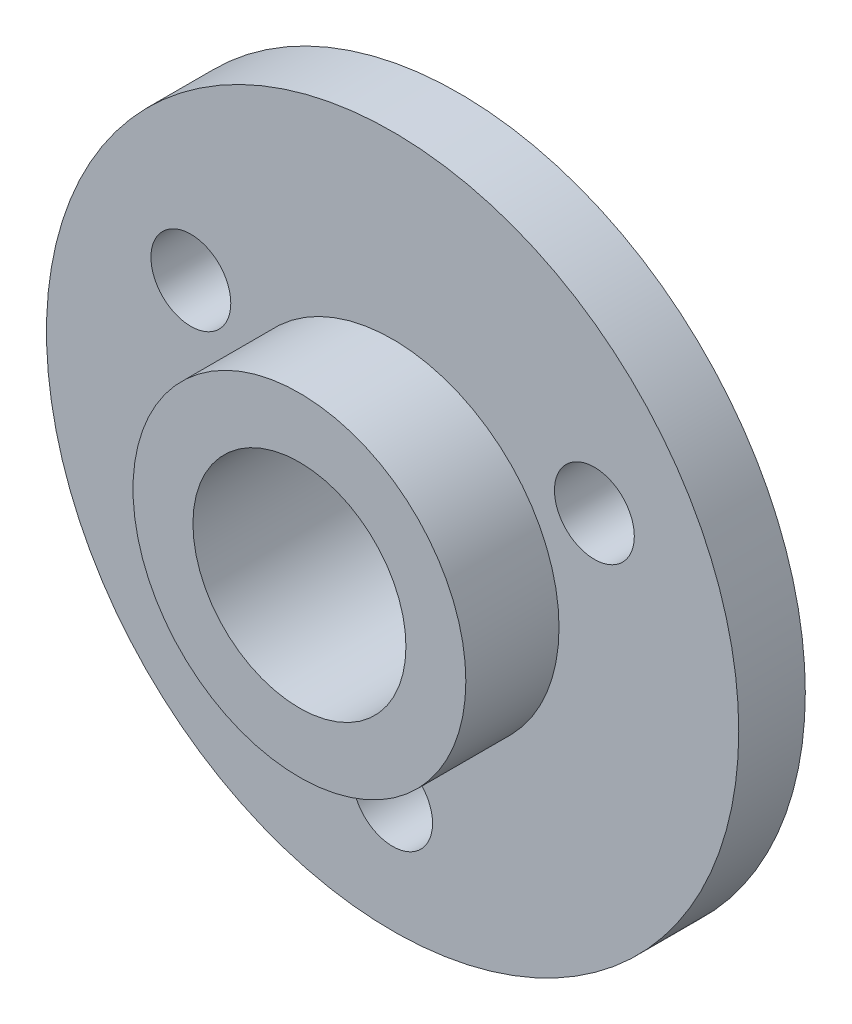
ISO-10303-21;
HEADER;
FILE_DESCRIPTION(('STEP AP214'),'2;1');
FILE_NAME('part.step','',(''),(''),'','','');
FILE_SCHEMA(('AUTOMOTIVE_DESIGN { 1 0 10303 214 1 1 1 1 }'));
ENDSEC;
DATA;
#1=APPLICATION_CONTEXT('core data for automotive mechanical design processes');
#2=APPLICATION_PROTOCOL_DEFINITION('international standard','automotive_design',2000,#1);
#3=PRODUCT_CONTEXT('',#1,'mechanical');
#4=PRODUCT('Part','Part','',(#3));
#5=PRODUCT_RELATED_PRODUCT_CATEGORY('part','',(#4));
#6=PRODUCT_DEFINITION_FORMATION('','',#4);
#7=PRODUCT_DEFINITION_CONTEXT('part definition',#1,'design');
#8=PRODUCT_DEFINITION('design','',#6,#7);
#9=PRODUCT_DEFINITION_SHAPE('','',#8);
#10=(LENGTH_UNIT() NAMED_UNIT(*) SI_UNIT(.MILLI.,.METRE.));
#11=(NAMED_UNIT(*) PLANE_ANGLE_UNIT() SI_UNIT($,.RADIAN.));
#12=(NAMED_UNIT(*) SI_UNIT($,.STERADIAN.) SOLID_ANGLE_UNIT());
#13=UNCERTAINTY_MEASURE_WITH_UNIT(LENGTH_MEASURE(1.E-05),#10,'distance_accuracy_value','');
#14=(GEOMETRIC_REPRESENTATION_CONTEXT(3) GLOBAL_UNCERTAINTY_ASSIGNED_CONTEXT((#13)) GLOBAL_UNIT_ASSIGNED_CONTEXT((#10,
#11,#12)) REPRESENTATION_CONTEXT('',''));
#15=CARTESIAN_POINT('',(0.,0.,0.));
#16=DIRECTION('',(0.,0.,1.));
#17=DIRECTION('',(1.,0.,0.));
#18=AXIS2_PLACEMENT_3D('',#15,#16,#17);
#19=CARTESIAN_POINT('',(0.,0.,5.));
#20=DIRECTION('',(0.,0.,-1.));
#21=DIRECTION('',(-1.,0.,0.));
#22=AXIS2_PLACEMENT_3D('',#19,#20,#21);
#23=CYLINDRICAL_SURFACE('',#22,26.);
#24=CARTESIAN_POINT('',(0.,0.,5.));
#25=DIRECTION('',(0.,0.,1.));
#26=DIRECTION('',(1.,0.,0.));
#27=AXIS2_PLACEMENT_3D('',#24,#25,#26);
#28=CIRCLE('',#27,26.);
#29=CARTESIAN_POINT('',(26.,0.,5.));
#30=VERTEX_POINT('',#29);
#31=EDGE_CURVE('E10',#30,#30,#28,.T.);
#32=ORIENTED_EDGE('',*,*,#31,.F.);
#33=EDGE_LOOP('',(#32));
#34=FACE_BOUND('',#33,.T.);
#35=CARTESIAN_POINT('',(0.,0.,0.));
#36=DIRECTION('',(0.,0.,1.));
#37=DIRECTION('',(1.,0.,0.));
#38=AXIS2_PLACEMENT_3D('',#35,#36,#37);
#39=CIRCLE('',#38,26.);
#40=CARTESIAN_POINT('',(26.,0.,0.));
#41=VERTEX_POINT('',#40);
#42=EDGE_CURVE('E65',#41,#41,#39,.T.);
#43=ORIENTED_EDGE('',*,*,#42,.T.);
#44=EDGE_LOOP('',(#43));
#45=FACE_BOUND('',#44,.T.);
#46=ADVANCED_FACE('F39',(#34,#45),#23,.T.);
#47=CARTESIAN_POINT('',(15.1554445662277,8.75000000000002,5.));
#48=DIRECTION('',(0.,0.,-1.));
#49=DIRECTION('',(-1.,0.,0.));
#50=AXIS2_PLACEMENT_3D('',#47,#48,#49);
#51=CYLINDRICAL_SURFACE('',#50,3.);
#52=CARTESIAN_POINT('',(15.1554445662277,8.75000000000002,5.));
#53=DIRECTION('',(0.,0.,1.));
#54=DIRECTION('',(1.,0.,0.));
#55=AXIS2_PLACEMENT_3D('',#52,#53,#54);
#56=CIRCLE('',#55,3.);
#57=CARTESIAN_POINT('',(18.1554445662277,8.75000000000002,5.));
#58=VERTEX_POINT('',#57);
#59=EDGE_CURVE('E47',#58,#58,#56,.T.);
#60=ORIENTED_EDGE('',*,*,#59,.T.);
#61=EDGE_LOOP('',(#60));
#62=FACE_BOUND('',#61,.T.);
#63=CARTESIAN_POINT('',(15.1554445662277,8.75000000000002,0.));
#64=DIRECTION('',(0.,0.,1.));
#65=DIRECTION('',(1.,0.,0.));
#66=AXIS2_PLACEMENT_3D('',#63,#64,#65);
#67=CIRCLE('',#66,3.);
#68=CARTESIAN_POINT('',(18.1554445662277,8.75000000000002,0.));
#69=VERTEX_POINT('',#68);
#70=EDGE_CURVE('E63',#69,#69,#67,.T.);
#71=ORIENTED_EDGE('',*,*,#70,.F.);
#72=EDGE_LOOP('',(#71));
#73=FACE_BOUND('',#72,.T.);
#74=ADVANCED_FACE('F110',(#62,#73),#51,.F.);
#75=CARTESIAN_POINT('',(-15.1554445662277,8.75000000000002,5.));
#76=DIRECTION('',(0.,0.,-1.));
#77=DIRECTION('',(-1.,0.,0.));
#78=AXIS2_PLACEMENT_3D('',#75,#76,#77);
#79=CYLINDRICAL_SURFACE('',#78,3.);
#80=CARTESIAN_POINT('',(-15.1554445662277,8.75000000000002,5.));
#81=DIRECTION('',(0.,0.,1.));
#82=DIRECTION('',(1.,0.,0.));
#83=AXIS2_PLACEMENT_3D('',#80,#81,#82);
#84=CIRCLE('',#83,3.);
#85=CARTESIAN_POINT('',(-12.1554445662277,8.75000000000002,5.));
#86=VERTEX_POINT('',#85);
#87=EDGE_CURVE('E52',#86,#86,#84,.T.);
#88=ORIENTED_EDGE('',*,*,#87,.T.);
#89=EDGE_LOOP('',(#88));
#90=FACE_BOUND('',#89,.T.);
#91=CARTESIAN_POINT('',(-15.1554445662277,8.75000000000002,0.));
#92=DIRECTION('',(0.,0.,1.));
#93=DIRECTION('',(1.,0.,0.));
#94=AXIS2_PLACEMENT_3D('',#91,#92,#93);
#95=CIRCLE('',#94,3.);
#96=CARTESIAN_POINT('',(-12.1554445662277,8.75000000000002,0.));
#97=VERTEX_POINT('',#96);
#98=EDGE_CURVE('E59',#97,#97,#95,.T.);
#99=ORIENTED_EDGE('',*,*,#98,.F.);
#100=EDGE_LOOP('',(#99));
#101=FACE_BOUND('',#100,.T.);
#102=ADVANCED_FACE('F116',(#90,#101),#79,.F.);
#103=CARTESIAN_POINT('',(0.,-17.5,5.));
#104=DIRECTION('',(0.,0.,-1.));
#105=DIRECTION('',(-1.,0.,0.));
#106=AXIS2_PLACEMENT_3D('',#103,#104,#105);
#107=CYLINDRICAL_SURFACE('',#106,3.);
#108=CARTESIAN_POINT('',(0.,-17.5,5.));
#109=DIRECTION('',(0.,0.,1.));
#110=DIRECTION('',(1.,0.,0.));
#111=AXIS2_PLACEMENT_3D('',#108,#109,#110);
#112=CIRCLE('',#111,3.);
#113=CARTESIAN_POINT('',(3.,-17.5,5.));
#114=VERTEX_POINT('',#113);
#115=EDGE_CURVE('E70',#114,#114,#112,.T.);
#116=ORIENTED_EDGE('',*,*,#115,.T.);
#117=EDGE_LOOP('',(#116));
#118=FACE_BOUND('',#117,.T.);
#119=CARTESIAN_POINT('',(0.,-17.5,0.));
#120=DIRECTION('',(0.,0.,1.));
#121=DIRECTION('',(1.,0.,0.));
#122=AXIS2_PLACEMENT_3D('',#119,#120,#121);
#123=CIRCLE('',#122,3.);
#124=CARTESIAN_POINT('',(3.,-17.5,0.));
#125=VERTEX_POINT('',#124);
#126=EDGE_CURVE('E56',#125,#125,#123,.T.);
#127=ORIENTED_EDGE('',*,*,#126,.F.);
#128=EDGE_LOOP('',(#127));
#129=FACE_BOUND('',#128,.T.);
#130=ADVANCED_FACE('F41',(#118,#129),#107,.F.);
#131=CARTESIAN_POINT('',(0.,0.,5.));
#132=DIRECTION('',(0.,0.,-1.));
#133=DIRECTION('',(-1.,0.,0.));
#134=AXIS2_PLACEMENT_3D('',#131,#132,#133);
#135=CYLINDRICAL_SURFACE('',#134,8.);
#136=CARTESIAN_POINT('',(0.,0.,0.));
#137=DIRECTION('',(0.,0.,1.));
#138=DIRECTION('',(1.,0.,0.));
#139=AXIS2_PLACEMENT_3D('',#136,#137,#138);
#140=CIRCLE('',#139,8.);
#141=CARTESIAN_POINT('',(8.,0.,0.));
#142=VERTEX_POINT('',#141);
#143=EDGE_CURVE('E43',#142,#142,#140,.T.);
#144=ORIENTED_EDGE('',*,*,#143,.F.);
#145=EDGE_LOOP('',(#144));
#146=FACE_BOUND('',#145,.T.);
#147=CARTESIAN_POINT('',(0.,0.,12.));
#148=DIRECTION('',(0.,0.,1.));
#149=DIRECTION('',(1.,0.,0.));
#150=AXIS2_PLACEMENT_3D('',#147,#148,#149);
#151=CIRCLE('',#150,8.);
#152=CARTESIAN_POINT('',(8.,0.,12.));
#153=VERTEX_POINT('',#152);
#154=EDGE_CURVE('E84',#153,#153,#151,.T.);
#155=ORIENTED_EDGE('',*,*,#154,.T.);
#156=EDGE_LOOP('',(#155));
#157=FACE_BOUND('',#156,.T.);
#158=ADVANCED_FACE('F88',(#146,#157),#135,.F.);
#159=CARTESIAN_POINT('',(0.,0.,5.));
#160=DIRECTION('',(0.,0.,1.));
#161=DIRECTION('',(1.,0.,0.));
#162=AXIS2_PLACEMENT_3D('',#159,#160,#161);
#163=PLANE('',#162);
#164=CARTESIAN_POINT('',(0.,0.,5.));
#165=DIRECTION('',(0.,0.,1.));
#166=DIRECTION('',(1.,0.,0.));
#167=AXIS2_PLACEMENT_3D('',#164,#165,#166);
#168=CIRCLE('',#167,12.5);
#169=CARTESIAN_POINT('',(12.5,0.,5.));
#170=VERTEX_POINT('',#169);
#171=EDGE_CURVE('E60',#170,#170,#168,.F.);
#172=ORIENTED_EDGE('',*,*,#171,.T.);
#173=EDGE_LOOP('',(#172));
#174=FACE_BOUND('',#173,.T.);
#175=ORIENTED_EDGE('',*,*,#115,.F.);
#176=EDGE_LOOP('',(#175));
#177=FACE_BOUND('',#176,.T.);
#178=ORIENTED_EDGE('',*,*,#87,.F.);
#179=EDGE_LOOP('',(#178));
#180=FACE_BOUND('',#179,.T.);
#181=ORIENTED_EDGE('',*,*,#59,.F.);
#182=EDGE_LOOP('',(#181));
#183=FACE_BOUND('',#182,.T.);
#184=ORIENTED_EDGE('',*,*,#31,.T.);
#185=EDGE_LOOP('',(#184));
#186=FACE_BOUND('',#185,.T.);
#187=ADVANCED_FACE('F104',(#174,#177,#180,#183,#186),#163,.T.);
#188=CARTESIAN_POINT('',(0.,0.,0.));
#189=DIRECTION('',(0.,0.,1.));
#190=DIRECTION('',(1.,0.,0.));
#191=AXIS2_PLACEMENT_3D('',#188,#189,#190);
#192=PLANE('',#191);
#193=ORIENTED_EDGE('',*,*,#126,.T.);
#194=EDGE_LOOP('',(#193));
#195=FACE_BOUND('',#194,.T.);
#196=ORIENTED_EDGE('',*,*,#98,.T.);
#197=EDGE_LOOP('',(#196));
#198=FACE_BOUND('',#197,.T.);
#199=ORIENTED_EDGE('',*,*,#70,.T.);
#200=EDGE_LOOP('',(#199));
#201=FACE_BOUND('',#200,.T.);
#202=ORIENTED_EDGE('',*,*,#42,.F.);
#203=EDGE_LOOP('',(#202));
#204=FACE_BOUND('',#203,.T.);
#205=ORIENTED_EDGE('',*,*,#143,.T.);
#206=EDGE_LOOP('',(#205));
#207=FACE_BOUND('',#206,.T.);
#208=ADVANCED_FACE('F98',(#195,#198,#201,#204,#207),#192,.F.);
#209=CARTESIAN_POINT('',(0.,0.,12.));
#210=DIRECTION('',(0.,0.,-1.));
#211=DIRECTION('',(-1.,0.,0.));
#212=AXIS2_PLACEMENT_3D('',#209,#210,#211);
#213=CYLINDRICAL_SURFACE('',#212,12.5);
#214=ORIENTED_EDGE('',*,*,#171,.F.);
#215=EDGE_LOOP('',(#214));
#216=FACE_BOUND('',#215,.T.);
#217=CARTESIAN_POINT('',(0.,0.,12.));
#218=DIRECTION('',(0.,0.,1.));
#219=DIRECTION('',(1.,0.,0.));
#220=AXIS2_PLACEMENT_3D('',#217,#218,#219);
#221=CIRCLE('',#220,12.5);
#222=CARTESIAN_POINT('',(12.5,0.,12.));
#223=VERTEX_POINT('',#222);
#224=EDGE_CURVE('E81',#223,#223,#221,.T.);
#225=ORIENTED_EDGE('',*,*,#224,.F.);
#226=EDGE_LOOP('',(#225));
#227=FACE_BOUND('',#226,.T.);
#228=ADVANCED_FACE('F93',(#216,#227),#213,.T.);
#229=CARTESIAN_POINT('',(0.,0.,12.));
#230=DIRECTION('',(0.,0.,1.));
#231=DIRECTION('',(1.,0.,0.));
#232=AXIS2_PLACEMENT_3D('',#229,#230,#231);
#233=PLANE('',#232);
#234=ORIENTED_EDGE('',*,*,#154,.F.);
#235=EDGE_LOOP('',(#234));
#236=FACE_BOUND('',#235,.T.);
#237=ORIENTED_EDGE('',*,*,#224,.T.);
#238=EDGE_LOOP('',(#237));
#239=FACE_BOUND('',#238,.T.);
#240=ADVANCED_FACE('F90',(#236,#239),#233,.T.);
#241=CLOSED_SHELL('',(#46,#74,#102,#130,#158,#187,#208,#228,#240));
#242=MANIFOLD_SOLID_BREP('B2',#241);
#243=ADVANCED_BREP_SHAPE_REPRESENTATION('',(#18,#242),#14);
#244=SHAPE_DEFINITION_REPRESENTATION(#9,#243);
ENDSEC;
END-ISO-10303-21;
